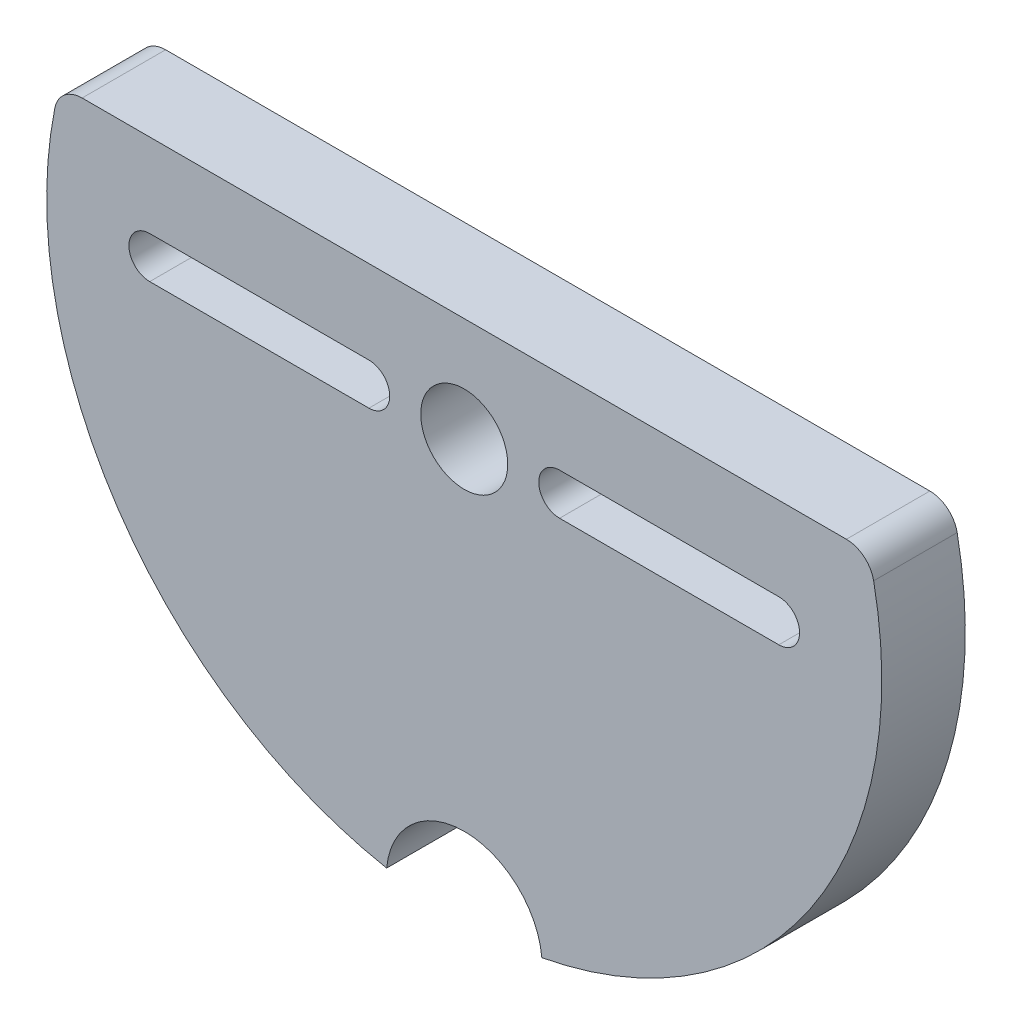
ISO-10303-21;
HEADER;
FILE_DESCRIPTION(('STEP AP214'),'2;1');
FILE_NAME('part.step','',(''),(''),'','','');
FILE_SCHEMA(('AUTOMOTIVE_DESIGN { 1 0 10303 214 1 1 1 1 }'));
ENDSEC;
DATA;
#1=APPLICATION_CONTEXT('core data for automotive mechanical design processes');
#2=APPLICATION_PROTOCOL_DEFINITION('international standard','automotive_design',2000,#1);
#3=PRODUCT_CONTEXT('',#1,'mechanical');
#4=PRODUCT('Part','Part','',(#3));
#5=PRODUCT_RELATED_PRODUCT_CATEGORY('part','',(#4));
#6=PRODUCT_DEFINITION_FORMATION('','',#4);
#7=PRODUCT_DEFINITION_CONTEXT('part definition',#1,'design');
#8=PRODUCT_DEFINITION('design','',#6,#7);
#9=PRODUCT_DEFINITION_SHAPE('','',#8);
#10=(LENGTH_UNIT() NAMED_UNIT(*) SI_UNIT(.MILLI.,.METRE.));
#11=(NAMED_UNIT(*) PLANE_ANGLE_UNIT() SI_UNIT($,.RADIAN.));
#12=(NAMED_UNIT(*) SI_UNIT($,.STERADIAN.) SOLID_ANGLE_UNIT());
#13=UNCERTAINTY_MEASURE_WITH_UNIT(LENGTH_MEASURE(1.E-05),#10,'distance_accuracy_value','');
#14=(GEOMETRIC_REPRESENTATION_CONTEXT(3) GLOBAL_UNCERTAINTY_ASSIGNED_CONTEXT((#13)) GLOBAL_UNIT_ASSIGNED_CONTEXT((#10,
#11,#12)) REPRESENTATION_CONTEXT('',''));
#15=CARTESIAN_POINT('',(0.,0.,0.));
#16=DIRECTION('',(0.,0.,1.));
#17=DIRECTION('',(1.,0.,0.));
#18=AXIS2_PLACEMENT_3D('',#15,#16,#17);
#19=CARTESIAN_POINT('',(0.,-19.05,3.81));
#20=DIRECTION('',(0.,0.,-1.));
#21=DIRECTION('',(-1.,0.,0.));
#22=AXIS2_PLACEMENT_3D('',#19,#20,#21);
#23=CYLINDRICAL_SURFACE('',#22,3.556);
#24=CARTESIAN_POINT('',(0.,-19.05,0.));
#25=DIRECTION('',(0.,0.,-1.));
#26=DIRECTION('',(-1.,0.,0.));
#27=AXIS2_PLACEMENT_3D('',#24,#25,#26);
#28=CIRCLE('',#27,3.556);
#29=CARTESIAN_POINT('',(-3.54047776652939,-18.7181066666667,0.));
#30=VERTEX_POINT('',#29);
#31=CARTESIAN_POINT('',(3.54047776652939,-18.7181066666667,0.));
#32=VERTEX_POINT('',#31);
#33=EDGE_CURVE('E172',#30,#32,#28,.T.);
#34=ORIENTED_EDGE('',*,*,#33,.T.);
#35=DIRECTION('',(0.,0.,-1.));
#36=VECTOR('',#35,1.);
#37=CARTESIAN_POINT('',(3.54047776652939,-18.7181066666667,3.81));
#38=LINE('',#37,#36);
#39=CARTESIAN_POINT('',(3.54047776652939,-18.7181066666667,3.81));
#40=VERTEX_POINT('',#39);
#41=EDGE_CURVE('E11',#40,#32,#38,.T.);
#42=ORIENTED_EDGE('',*,*,#41,.F.);
#43=CARTESIAN_POINT('',(0.,-19.05,3.81));
#44=DIRECTION('',(0.,0.,-1.));
#45=DIRECTION('',(-1.,0.,0.));
#46=AXIS2_PLACEMENT_3D('',#43,#44,#45);
#47=CIRCLE('',#46,3.556);
#48=CARTESIAN_POINT('',(-3.54047776652939,-18.7181066666667,3.81));
#49=VERTEX_POINT('',#48);
#50=EDGE_CURVE('E211',#49,#40,#47,.T.);
#51=ORIENTED_EDGE('',*,*,#50,.F.);
#52=DIRECTION('',(0.,0.,-1.));
#53=VECTOR('',#52,1.);
#54=CARTESIAN_POINT('',(-3.54047776652939,-18.7181066666667,3.81));
#55=LINE('',#54,#53);
#56=EDGE_CURVE('E225',#49,#30,#55,.T.);
#57=ORIENTED_EDGE('',*,*,#56,.T.);
#58=EDGE_LOOP('',(#34,#42,#51,#57));
#59=FACE_BOUND('',#58,.T.);
#60=ADVANCED_FACE('F35',(#59),#23,.F.);
#61=CARTESIAN_POINT('',(0.,0.,3.81));
#62=DIRECTION('',(0.,0.,-1.));
#63=DIRECTION('',(-1.,0.,0.));
#64=AXIS2_PLACEMENT_3D('',#61,#62,#63);
#65=CYLINDRICAL_SURFACE('',#64,19.05);
#66=CARTESIAN_POINT('',(0.,0.,0.));
#67=DIRECTION('',(0.,0.,1.));
#68=DIRECTION('',(-1.,0.,0.));
#69=AXIS2_PLACEMENT_3D('',#66,#67,#68);
#70=CIRCLE('',#69,19.05);
#71=CARTESIAN_POINT('',(18.6788705034442,3.74196428571429,0.));
#72=VERTEX_POINT('',#71);
#73=EDGE_CURVE('E228',#32,#72,#70,.T.);
#74=ORIENTED_EDGE('',*,*,#73,.T.);
#75=DIRECTION('',(0.,0.,-1.));
#76=VECTOR('',#75,1.);
#77=CARTESIAN_POINT('',(18.6788705034442,3.74196428571429,3.81));
#78=LINE('',#77,#76);
#79=CARTESIAN_POINT('',(18.6788705034442,3.74196428571429,3.81));
#80=VERTEX_POINT('',#79);
#81=EDGE_CURVE('E42',#80,#72,#78,.T.);
#82=ORIENTED_EDGE('',*,*,#81,.F.);
#83=CARTESIAN_POINT('',(0.,0.,3.81));
#84=DIRECTION('',(0.,0.,1.));
#85=DIRECTION('',(-1.,0.,0.));
#86=AXIS2_PLACEMENT_3D('',#83,#84,#85);
#87=CIRCLE('',#86,19.05);
#88=EDGE_CURVE('E214',#40,#80,#87,.T.);
#89=ORIENTED_EDGE('',*,*,#88,.F.);
#90=ORIENTED_EDGE('',*,*,#41,.T.);
#91=EDGE_LOOP('',(#74,#82,#89,#90));
#92=FACE_BOUND('',#91,.T.);
#93=ADVANCED_FACE('F274',(#92),#65,.T.);
#94=CARTESIAN_POINT('',(17.4336124698813,3.4925,3.81));
#95=DIRECTION('',(0.,0.,-1.));
#96=DIRECTION('',(-1.,0.,0.));
#97=AXIS2_PLACEMENT_3D('',#94,#95,#96);
#98=CYLINDRICAL_SURFACE('',#97,1.27);
#99=CARTESIAN_POINT('',(17.4336124698813,3.4925,0.));
#100=DIRECTION('',(0.,0.,1.));
#101=DIRECTION('',(-1.,0.,0.));
#102=AXIS2_PLACEMENT_3D('',#99,#100,#101);
#103=CIRCLE('',#102,1.27);
#104=CARTESIAN_POINT('',(17.4336124698813,4.7625,0.));
#105=VERTEX_POINT('',#104);
#106=EDGE_CURVE('E230',#72,#105,#103,.T.);
#107=ORIENTED_EDGE('',*,*,#106,.T.);
#108=DIRECTION('',(0.,0.,-1.));
#109=VECTOR('',#108,1.);
#110=CARTESIAN_POINT('',(17.4336124698813,4.7625,3.81));
#111=LINE('',#110,#109);
#112=CARTESIAN_POINT('',(17.4336124698813,4.7625,3.81));
#113=VERTEX_POINT('',#112);
#114=EDGE_CURVE('E245',#113,#105,#111,.T.);
#115=ORIENTED_EDGE('',*,*,#114,.F.);
#116=CARTESIAN_POINT('',(17.4336124698813,3.4925,3.81));
#117=DIRECTION('',(0.,0.,1.));
#118=DIRECTION('',(-1.,0.,0.));
#119=AXIS2_PLACEMENT_3D('',#116,#117,#118);
#120=CIRCLE('',#119,1.27);
#121=EDGE_CURVE('E217',#80,#113,#120,.T.);
#122=ORIENTED_EDGE('',*,*,#121,.F.);
#123=ORIENTED_EDGE('',*,*,#81,.T.);
#124=EDGE_LOOP('',(#107,#115,#122,#123));
#125=FACE_BOUND('',#124,.T.);
#126=ADVANCED_FACE('F252',(#125),#98,.T.);
#127=CARTESIAN_POINT('',(17.4336124698813,4.7625,3.81));
#128=DIRECTION('',(0.,-1.,0.));
#129=DIRECTION('',(1.,0.,0.));
#130=AXIS2_PLACEMENT_3D('',#127,#128,#129);
#131=PLANE('',#130);
#132=DIRECTION('',(-1.,0.,0.));
#133=VECTOR('',#132,1.);
#134=CARTESIAN_POINT('',(17.4336124698813,4.7625,0.));
#135=LINE('',#134,#133);
#136=CARTESIAN_POINT('',(-17.4336124698813,4.7625,0.));
#137=VERTEX_POINT('',#136);
#138=EDGE_CURVE('E232',#105,#137,#135,.T.);
#139=ORIENTED_EDGE('',*,*,#138,.T.);
#140=DIRECTION('',(0.,0.,-1.));
#141=VECTOR('',#140,1.);
#142=CARTESIAN_POINT('',(-17.4336124698813,4.7625,3.81));
#143=LINE('',#142,#141);
#144=CARTESIAN_POINT('',(-17.4336124698813,4.7625,3.81));
#145=VERTEX_POINT('',#144);
#146=EDGE_CURVE('E242',#145,#137,#143,.T.);
#147=ORIENTED_EDGE('',*,*,#146,.F.);
#148=DIRECTION('',(-1.,0.,0.));
#149=VECTOR('',#148,1.);
#150=CARTESIAN_POINT('',(17.4336124698813,4.7625,3.81));
#151=LINE('',#150,#149);
#152=EDGE_CURVE('E219',#113,#145,#151,.T.);
#153=ORIENTED_EDGE('',*,*,#152,.F.);
#154=ORIENTED_EDGE('',*,*,#114,.T.);
#155=EDGE_LOOP('',(#139,#147,#153,#154));
#156=FACE_BOUND('',#155,.T.);
#157=ADVANCED_FACE('F262',(#156),#131,.F.);
#158=CARTESIAN_POINT('',(-17.4336124698813,3.4925,3.81));
#159=DIRECTION('',(0.,0.,-1.));
#160=DIRECTION('',(-1.,0.,0.));
#161=AXIS2_PLACEMENT_3D('',#158,#159,#160);
#162=CYLINDRICAL_SURFACE('',#161,1.27);
#163=CARTESIAN_POINT('',(-17.4336124698813,3.4925,0.));
#164=DIRECTION('',(0.,0.,1.));
#165=DIRECTION('',(1.,0.,0.));
#166=AXIS2_PLACEMENT_3D('',#163,#164,#165);
#167=CIRCLE('',#166,1.27);
#168=CARTESIAN_POINT('',(-18.6788705034442,3.74196428571428,0.));
#169=VERTEX_POINT('',#168);
#170=EDGE_CURVE('E234',#137,#169,#167,.T.);
#171=ORIENTED_EDGE('',*,*,#170,.T.);
#172=DIRECTION('',(0.,0.,-1.));
#173=VECTOR('',#172,1.);
#174=CARTESIAN_POINT('',(-18.6788705034442,3.74196428571428,3.81));
#175=LINE('',#174,#173);
#176=CARTESIAN_POINT('',(-18.6788705034442,3.74196428571428,3.81));
#177=VERTEX_POINT('',#176);
#178=EDGE_CURVE('E239',#177,#169,#175,.T.);
#179=ORIENTED_EDGE('',*,*,#178,.F.);
#180=CARTESIAN_POINT('',(-17.4336124698813,3.4925,3.81));
#181=DIRECTION('',(0.,0.,1.));
#182=DIRECTION('',(1.,0.,0.));
#183=AXIS2_PLACEMENT_3D('',#180,#181,#182);
#184=CIRCLE('',#183,1.27);
#185=EDGE_CURVE('E221',#145,#177,#184,.T.);
#186=ORIENTED_EDGE('',*,*,#185,.F.);
#187=ORIENTED_EDGE('',*,*,#146,.T.);
#188=EDGE_LOOP('',(#171,#179,#186,#187));
#189=FACE_BOUND('',#188,.T.);
#190=ADVANCED_FACE('F266',(#189),#162,.T.);
#191=CARTESIAN_POINT('',(0.,0.,3.81));
#192=DIRECTION('',(0.,0.,-1.));
#193=DIRECTION('',(-1.,0.,0.));
#194=AXIS2_PLACEMENT_3D('',#191,#192,#193);
#195=CYLINDRICAL_SURFACE('',#194,19.05);
#196=CARTESIAN_POINT('',(0.,0.,0.));
#197=DIRECTION('',(0.,0.,1.));
#198=DIRECTION('',(1.,0.,0.));
#199=AXIS2_PLACEMENT_3D('',#196,#197,#198);
#200=CIRCLE('',#199,19.05);
#201=EDGE_CURVE('E215',#169,#30,#200,.T.);
#202=ORIENTED_EDGE('',*,*,#201,.T.);
#203=ORIENTED_EDGE('',*,*,#56,.F.);
#204=CARTESIAN_POINT('',(0.,0.,3.81));
#205=DIRECTION('',(0.,0.,1.));
#206=DIRECTION('',(1.,0.,0.));
#207=AXIS2_PLACEMENT_3D('',#204,#205,#206);
#208=CIRCLE('',#207,19.05);
#209=EDGE_CURVE('E223',#177,#49,#208,.T.);
#210=ORIENTED_EDGE('',*,*,#209,.F.);
#211=ORIENTED_EDGE('',*,*,#178,.T.);
#212=EDGE_LOOP('',(#202,#203,#210,#211));
#213=FACE_BOUND('',#212,.T.);
#214=ADVANCED_FACE('F277',(#213),#195,.T.);
#215=CARTESIAN_POINT('',(0.,-19.05,3.81));
#216=DIRECTION('',(0.,0.,-1.));
#217=DIRECTION('',(-1.,0.,0.));
#218=AXIS2_PLACEMENT_3D('',#215,#216,#217);
#219=PLANE('',#218);
#220=DIRECTION('',(1.,0.,0.));
#221=VECTOR('',#220,1.);
#222=CARTESIAN_POINT('',(-14.350000002,-0.95,3.81));
#223=LINE('',#222,#221);
#224=CARTESIAN_POINT('',(-14.350000002,-0.949999999999999,3.81));
#225=VERTEX_POINT('',#224);
#226=CARTESIAN_POINT('',(-4.35,-0.95,3.81));
#227=VERTEX_POINT('',#226);
#228=EDGE_CURVE('E165',#225,#227,#223,.T.);
#229=ORIENTED_EDGE('',*,*,#228,.F.);
#230=CARTESIAN_POINT('',(-14.350000002,0.,3.81));
#231=DIRECTION('',(0.,0.,1.));
#232=DIRECTION('',(1.,0.,0.));
#233=AXIS2_PLACEMENT_3D('',#230,#231,#232);
#234=CIRCLE('',#233,0.95);
#235=CARTESIAN_POINT('',(-14.350000002,0.95,3.81));
#236=VERTEX_POINT('',#235);
#237=EDGE_CURVE('E49',#236,#225,#234,.T.);
#238=ORIENTED_EDGE('',*,*,#237,.F.);
#239=DIRECTION('',(-1.,0.,0.));
#240=VECTOR('',#239,1.);
#241=CARTESIAN_POINT('',(-14.350000002,0.95,3.81));
#242=LINE('',#241,#240);
#243=CARTESIAN_POINT('',(-4.35,0.95,3.81));
#244=VERTEX_POINT('',#243);
#245=EDGE_CURVE('E156',#244,#236,#242,.T.);
#246=ORIENTED_EDGE('',*,*,#245,.F.);
#247=CARTESIAN_POINT('',(-4.35,0.,3.81));
#248=DIRECTION('',(0.,0.,1.));
#249=DIRECTION('',(1.,0.,0.));
#250=AXIS2_PLACEMENT_3D('',#247,#248,#249);
#251=CIRCLE('',#250,0.95);
#252=EDGE_CURVE('E159',#227,#244,#251,.T.);
#253=ORIENTED_EDGE('',*,*,#252,.F.);
#254=EDGE_LOOP('',(#229,#238,#246,#253));
#255=FACE_BOUND('',#254,.T.);
#256=DIRECTION('',(1.,0.,0.));
#257=VECTOR('',#256,1.);
#258=CARTESIAN_POINT('',(4.35,-0.95,3.81));
#259=LINE('',#258,#257);
#260=CARTESIAN_POINT('',(4.35,-0.950000000000001,3.81));
#261=VERTEX_POINT('',#260);
#262=CARTESIAN_POINT('',(14.350000002,-0.950000000000001,3.81));
#263=VERTEX_POINT('',#262);
#264=EDGE_CURVE('E191',#261,#263,#259,.T.);
#265=ORIENTED_EDGE('',*,*,#264,.F.);
#266=CARTESIAN_POINT('',(4.35,0.,3.81));
#267=DIRECTION('',(0.,0.,1.));
#268=DIRECTION('',(1.,0.,0.));
#269=AXIS2_PLACEMENT_3D('',#266,#267,#268);
#270=CIRCLE('',#269,0.95);
#271=CARTESIAN_POINT('',(4.35,0.95,3.81));
#272=VERTEX_POINT('',#271);
#273=EDGE_CURVE('E57',#272,#261,#270,.T.);
#274=ORIENTED_EDGE('',*,*,#273,.F.);
#275=DIRECTION('',(-1.,0.,0.));
#276=VECTOR('',#275,1.);
#277=CARTESIAN_POINT('',(4.35,0.95,3.81));
#278=LINE('',#277,#276);
#279=CARTESIAN_POINT('',(14.350000002,0.950000000000005,3.81));
#280=VERTEX_POINT('',#279);
#281=EDGE_CURVE('E180',#280,#272,#278,.T.);
#282=ORIENTED_EDGE('',*,*,#281,.F.);
#283=CARTESIAN_POINT('',(14.350000002,0.,3.81));
#284=DIRECTION('',(0.,0.,1.));
#285=DIRECTION('',(1.,0.,0.));
#286=AXIS2_PLACEMENT_3D('',#283,#284,#285);
#287=CIRCLE('',#286,0.95);
#288=EDGE_CURVE('E195',#263,#280,#287,.T.);
#289=ORIENTED_EDGE('',*,*,#288,.F.);
#290=EDGE_LOOP('',(#265,#274,#282,#289));
#291=FACE_BOUND('',#290,.T.);
#292=CARTESIAN_POINT('',(0.,0.,3.81));
#293=DIRECTION('',(0.,0.,1.));
#294=DIRECTION('',(1.,0.,0.));
#295=AXIS2_PLACEMENT_3D('',#292,#293,#294);
#296=CIRCLE('',#295,1.984375);
#297=CARTESIAN_POINT('',(1.984375,0.,3.81));
#298=VERTEX_POINT('',#297);
#299=EDGE_CURVE('E208',#298,#298,#296,.T.);
#300=ORIENTED_EDGE('',*,*,#299,.F.);
#301=EDGE_LOOP('',(#300));
#302=FACE_BOUND('',#301,.T.);
#303=ORIENTED_EDGE('',*,*,#50,.T.);
#304=ORIENTED_EDGE('',*,*,#88,.T.);
#305=ORIENTED_EDGE('',*,*,#121,.T.);
#306=ORIENTED_EDGE('',*,*,#152,.T.);
#307=ORIENTED_EDGE('',*,*,#185,.T.);
#308=ORIENTED_EDGE('',*,*,#209,.T.);
#309=EDGE_LOOP('',(#303,#304,#305,#306,#307,#308));
#310=FACE_BOUND('',#309,.T.);
#311=ADVANCED_FACE('F270',(#255,#291,#302,#310),#219,.F.);
#312=CARTESIAN_POINT('',(0.,-19.05,0.));
#313=DIRECTION('',(0.,0.,-1.));
#314=DIRECTION('',(-1.,0.,0.));
#315=AXIS2_PLACEMENT_3D('',#312,#313,#314);
#316=PLANE('',#315);
#317=CARTESIAN_POINT('',(-14.350000002,0.,0.));
#318=DIRECTION('',(0.,0.,1.));
#319=DIRECTION('',(1.,0.,0.));
#320=AXIS2_PLACEMENT_3D('',#317,#318,#319);
#321=CIRCLE('',#320,0.95);
#322=CARTESIAN_POINT('',(-14.350000002,0.95,0.));
#323=VERTEX_POINT('',#322);
#324=CARTESIAN_POINT('',(-14.350000002,-0.95,0.));
#325=VERTEX_POINT('',#324);
#326=EDGE_CURVE('E137',#323,#325,#321,.T.);
#327=ORIENTED_EDGE('',*,*,#326,.T.);
#328=DIRECTION('',(1.,0.,0.));
#329=VECTOR('',#328,1.);
#330=CARTESIAN_POINT('',(-14.350000002,-0.95,0.));
#331=LINE('',#330,#329);
#332=CARTESIAN_POINT('',(-4.35,-0.95,0.));
#333=VERTEX_POINT('',#332);
#334=EDGE_CURVE('E147',#325,#333,#331,.T.);
#335=ORIENTED_EDGE('',*,*,#334,.T.);
#336=CARTESIAN_POINT('',(-4.35,0.,0.));
#337=DIRECTION('',(0.,0.,1.));
#338=DIRECTION('',(1.,0.,0.));
#339=AXIS2_PLACEMENT_3D('',#336,#337,#338);
#340=CIRCLE('',#339,0.95);
#341=CARTESIAN_POINT('',(-4.35,0.95,0.));
#342=VERTEX_POINT('',#341);
#343=EDGE_CURVE('E151',#333,#342,#340,.T.);
#344=ORIENTED_EDGE('',*,*,#343,.T.);
#345=DIRECTION('',(-1.,0.,0.));
#346=VECTOR('',#345,1.);
#347=CARTESIAN_POINT('',(-14.350000002,0.95,0.));
#348=LINE('',#347,#346);
#349=EDGE_CURVE('E143',#342,#323,#348,.T.);
#350=ORIENTED_EDGE('',*,*,#349,.T.);
#351=EDGE_LOOP('',(#327,#335,#344,#350));
#352=FACE_BOUND('',#351,.T.);
#353=CARTESIAN_POINT('',(4.35,0.,0.));
#354=DIRECTION('',(0.,0.,1.));
#355=DIRECTION('',(1.,0.,0.));
#356=AXIS2_PLACEMENT_3D('',#353,#354,#355);
#357=CIRCLE('',#356,0.95);
#358=CARTESIAN_POINT('',(4.35,0.95,0.));
#359=VERTEX_POINT('',#358);
#360=CARTESIAN_POINT('',(4.35,-0.95,0.));
#361=VERTEX_POINT('',#360);
#362=EDGE_CURVE('E176',#359,#361,#357,.T.);
#363=ORIENTED_EDGE('',*,*,#362,.T.);
#364=DIRECTION('',(1.,0.,0.));
#365=VECTOR('',#364,1.);
#366=CARTESIAN_POINT('',(4.35,-0.95,0.));
#367=LINE('',#366,#365);
#368=CARTESIAN_POINT('',(14.350000002,-0.949999999999995,0.));
#369=VERTEX_POINT('',#368);
#370=EDGE_CURVE('E179',#361,#369,#367,.T.);
#371=ORIENTED_EDGE('',*,*,#370,.T.);
#372=CARTESIAN_POINT('',(14.350000002,0.,0.));
#373=DIRECTION('',(0.,0.,1.));
#374=DIRECTION('',(1.,0.,0.));
#375=AXIS2_PLACEMENT_3D('',#372,#373,#374);
#376=CIRCLE('',#375,0.95);
#377=CARTESIAN_POINT('',(14.350000002,0.950000000000005,0.));
#378=VERTEX_POINT('',#377);
#379=EDGE_CURVE('E183',#369,#378,#376,.T.);
#380=ORIENTED_EDGE('',*,*,#379,.T.);
#381=DIRECTION('',(-1.,0.,0.));
#382=VECTOR('',#381,1.);
#383=CARTESIAN_POINT('',(4.35,0.95,0.));
#384=LINE('',#383,#382);
#385=EDGE_CURVE('E186',#378,#359,#384,.T.);
#386=ORIENTED_EDGE('',*,*,#385,.T.);
#387=EDGE_LOOP('',(#363,#371,#380,#386));
#388=FACE_BOUND('',#387,.T.);
#389=CARTESIAN_POINT('',(0.,0.,0.));
#390=DIRECTION('',(0.,0.,1.));
#391=DIRECTION('',(1.,0.,0.));
#392=AXIS2_PLACEMENT_3D('',#389,#390,#391);
#393=CIRCLE('',#392,1.984375);
#394=CARTESIAN_POINT('',(1.984375,0.,0.));
#395=VERTEX_POINT('',#394);
#396=EDGE_CURVE('E192',#395,#395,#393,.T.);
#397=ORIENTED_EDGE('',*,*,#396,.T.);
#398=EDGE_LOOP('',(#397));
#399=FACE_BOUND('',#398,.T.);
#400=ORIENTED_EDGE('',*,*,#33,.F.);
#401=ORIENTED_EDGE('',*,*,#201,.F.);
#402=ORIENTED_EDGE('',*,*,#170,.F.);
#403=ORIENTED_EDGE('',*,*,#138,.F.);
#404=ORIENTED_EDGE('',*,*,#106,.F.);
#405=ORIENTED_EDGE('',*,*,#73,.F.);
#406=EDGE_LOOP('',(#400,#401,#402,#403,#404,#405));
#407=FACE_BOUND('',#406,.T.);
#408=ADVANCED_FACE('F153',(#352,#388,#399,#407),#316,.T.);
#409=CARTESIAN_POINT('',(0.,0.,0.));
#410=DIRECTION('',(0.,0.,1.));
#411=DIRECTION('',(1.,0.,0.));
#412=AXIS2_PLACEMENT_3D('',#409,#410,#411);
#413=CYLINDRICAL_SURFACE('',#412,1.984375);
#414=CARTESIAN_POINT('',(1.984375,0.,0.));
#415=CARTESIAN_POINT('',(1.984375,0.,0.0396874999999999));
#416=CARTESIAN_POINT('',(1.984375,0.,0.079375));
#417=CARTESIAN_POINT('',(1.984375,0.,0.15875));
#418=CARTESIAN_POINT('',(1.984375,0.,0.1984375));
#419=CARTESIAN_POINT('',(1.984375,0.,0.2778125));
#420=CARTESIAN_POINT('',(1.984375,0.,0.3175));
#421=CARTESIAN_POINT('',(1.984375,0.,0.396875));
#422=CARTESIAN_POINT('',(1.984375,0.,0.4365625));
#423=CARTESIAN_POINT('',(1.984375,0.,0.5159375));
#424=CARTESIAN_POINT('',(1.984375,0.,0.555625));
#425=CARTESIAN_POINT('',(1.984375,0.,0.635));
#426=CARTESIAN_POINT('',(1.984375,0.,0.6746875));
#427=CARTESIAN_POINT('',(1.984375,0.,0.7540625));
#428=CARTESIAN_POINT('',(1.984375,0.,0.79375));
#429=CARTESIAN_POINT('',(1.984375,0.,0.873125));
#430=CARTESIAN_POINT('',(1.984375,0.,0.9128125));
#431=CARTESIAN_POINT('',(1.984375,0.,0.9921875));
#432=CARTESIAN_POINT('',(1.984375,0.,1.031875));
#433=CARTESIAN_POINT('',(1.984375,0.,1.11125));
#434=CARTESIAN_POINT('',(1.984375,0.,1.1509375));
#435=CARTESIAN_POINT('',(1.984375,0.,1.2303125));
#436=CARTESIAN_POINT('',(1.984375,0.,1.27));
#437=CARTESIAN_POINT('',(1.984375,0.,1.349375));
#438=CARTESIAN_POINT('',(1.984375,0.,1.3890625));
#439=CARTESIAN_POINT('',(1.984375,0.,1.4684375));
#440=CARTESIAN_POINT('',(1.984375,0.,1.508125));
#441=CARTESIAN_POINT('',(1.984375,0.,1.5875));
#442=CARTESIAN_POINT('',(1.984375,0.,1.6271875));
#443=CARTESIAN_POINT('',(1.984375,0.,1.7065625));
#444=CARTESIAN_POINT('',(1.984375,0.,1.74625));
#445=CARTESIAN_POINT('',(1.984375,0.,1.825625));
#446=CARTESIAN_POINT('',(1.984375,0.,1.8653125));
#447=CARTESIAN_POINT('',(1.984375,0.,1.9446875));
#448=CARTESIAN_POINT('',(1.984375,0.,1.984375));
#449=CARTESIAN_POINT('',(1.984375,0.,2.06375));
#450=CARTESIAN_POINT('',(1.984375,0.,2.1034375));
#451=CARTESIAN_POINT('',(1.984375,0.,2.1828125));
#452=CARTESIAN_POINT('',(1.984375,0.,2.2225));
#453=CARTESIAN_POINT('',(1.984375,0.,2.301875));
#454=CARTESIAN_POINT('',(1.984375,0.,2.3415625));
#455=CARTESIAN_POINT('',(1.984375,0.,2.4209375));
#456=CARTESIAN_POINT('',(1.984375,0.,2.460625));
#457=CARTESIAN_POINT('',(1.984375,0.,2.54));
#458=CARTESIAN_POINT('',(1.984375,0.,2.5796875));
#459=CARTESIAN_POINT('',(1.984375,0.,2.6590625));
#460=CARTESIAN_POINT('',(1.984375,0.,2.69875));
#461=CARTESIAN_POINT('',(1.984375,0.,2.778125));
#462=CARTESIAN_POINT('',(1.984375,0.,2.8178125));
#463=CARTESIAN_POINT('',(1.984375,0.,2.8971875));
#464=CARTESIAN_POINT('',(1.984375,0.,2.936875));
#465=CARTESIAN_POINT('',(1.984375,0.,3.01625));
#466=CARTESIAN_POINT('',(1.984375,0.,3.0559375));
#467=CARTESIAN_POINT('',(1.984375,0.,3.1353125));
#468=CARTESIAN_POINT('',(1.984375,0.,3.175));
#469=CARTESIAN_POINT('',(1.984375,0.,3.254375));
#470=CARTESIAN_POINT('',(1.984375,0.,3.2940625));
#471=CARTESIAN_POINT('',(1.984375,0.,3.3734375));
#472=CARTESIAN_POINT('',(1.984375,0.,3.413125));
#473=CARTESIAN_POINT('',(1.984375,0.,3.4925));
#474=CARTESIAN_POINT('',(1.984375,0.,3.5321875));
#475=CARTESIAN_POINT('',(1.984375,0.,3.6115625));
#476=CARTESIAN_POINT('',(1.984375,0.,3.65125));
#477=CARTESIAN_POINT('',(1.984375,0.,3.730625));
#478=CARTESIAN_POINT('',(1.984375,0.,3.7703125));
#479=CARTESIAN_POINT('',(1.984375,0.,3.81));
#480=B_SPLINE_CURVE_WITH_KNOTS('',3,(#414,#415,#416,#417,#418,#419,#420,#421,#422,#423,#424,
#425,#426,#427,#428,#429,#430,#431,#432,#433,#434,#435,#436,#437,#438,#439,#440,#441,#442,#443,
#444,#445,#446,#447,#448,#449,#450,#451,#452,#453,#454,#455,#456,#457,#458,#459,#460,#461,#462,
#463,#464,#465,#466,#467,#468,#469,#470,#471,#472,#473,#474,#475,#476,#477,#478,#479),
.UNSPECIFIED.,.F.,.F.,(4,2,2,2,2,2,2,2,2,2,2,2,2,2,2,2,2,2,2,2,2,2,2,2,2,2,2,2,2,2,2,2,4),(0.,
0.1190625,0.238125,0.3571875,0.47625,0.5953125,0.714375,0.8334375,0.9525,1.0715625,1.190625,
1.3096875,1.42875,1.5478125,1.666875,1.7859375,1.905,2.0240625,2.143125,2.2621875,2.38125,
2.5003125,2.619375,2.7384375,2.8575,2.9765625,3.095625,3.2146875,3.33375,3.4528125,3.571875,
3.6909375,3.81),.UNSPECIFIED.);
#481=EDGE_CURVE('BSEAM325',#395,#298,#480,.T.);
#482=ORIENTED_EDGE('',*,*,#396,.F.);
#483=ORIENTED_EDGE('',*,*,#299,.T.);
#484=ORIENTED_EDGE('',*,*,#481,.T.);
#485=ORIENTED_EDGE('',*,*,#481,.F.);
#486=EDGE_LOOP('',(#482,#484,#483,#485));
#487=FACE_BOUND('',#486,.T.);
#488=ADVANCED_FACE('F325',(#487),#413,.F.);
#489=CARTESIAN_POINT('',(4.35,0.,0.));
#490=DIRECTION('',(0.,0.,1.));
#491=DIRECTION('',(1.,0.,0.));
#492=AXIS2_PLACEMENT_3D('',#489,#490,#491);
#493=CYLINDRICAL_SURFACE('',#492,0.95);
#494=ORIENTED_EDGE('',*,*,#273,.T.);
#495=DIRECTION('',(0.,0.,1.));
#496=VECTOR('',#495,1.);
#497=CARTESIAN_POINT('',(4.35,-0.95,0.));
#498=LINE('',#497,#496);
#499=EDGE_CURVE('E189',#361,#261,#498,.T.);
#500=ORIENTED_EDGE('',*,*,#499,.F.);
#501=ORIENTED_EDGE('',*,*,#362,.F.);
#502=DIRECTION('',(0.,0.,1.));
#503=VECTOR('',#502,1.);
#504=CARTESIAN_POINT('',(4.35,0.95,0.));
#505=LINE('',#504,#503);
#506=EDGE_CURVE('E166',#359,#272,#505,.T.);
#507=ORIENTED_EDGE('',*,*,#506,.T.);
#508=EDGE_LOOP('',(#494,#500,#501,#507));
#509=FACE_BOUND('',#508,.T.);
#510=ADVANCED_FACE('F333',(#509),#493,.F.);
#511=CARTESIAN_POINT('',(4.35,0.95,0.));
#512=DIRECTION('',(0.,1.,0.));
#513=DIRECTION('',(-1.,0.,0.));
#514=AXIS2_PLACEMENT_3D('',#511,#512,#513);
#515=PLANE('',#514);
#516=ORIENTED_EDGE('',*,*,#281,.T.);
#517=ORIENTED_EDGE('',*,*,#506,.F.);
#518=ORIENTED_EDGE('',*,*,#385,.F.);
#519=DIRECTION('',(0.,0.,1.));
#520=VECTOR('',#519,1.);
#521=CARTESIAN_POINT('',(14.350000002,0.950000000000005,0.));
#522=LINE('',#521,#520);
#523=EDGE_CURVE('E201',#378,#280,#522,.T.);
#524=ORIENTED_EDGE('',*,*,#523,.T.);
#525=EDGE_LOOP('',(#516,#517,#518,#524));
#526=FACE_BOUND('',#525,.T.);
#527=ADVANCED_FACE('F343',(#526),#515,.F.);
#528=CARTESIAN_POINT('',(14.350000002,0.,0.));
#529=DIRECTION('',(0.,0.,1.));
#530=DIRECTION('',(1.,0.,0.));
#531=AXIS2_PLACEMENT_3D('',#528,#529,#530);
#532=CYLINDRICAL_SURFACE('',#531,0.95);
#533=ORIENTED_EDGE('',*,*,#288,.T.);
#534=ORIENTED_EDGE('',*,*,#523,.F.);
#535=ORIENTED_EDGE('',*,*,#379,.F.);
#536=DIRECTION('',(0.,0.,1.));
#537=VECTOR('',#536,1.);
#538=CARTESIAN_POINT('',(14.350000002,-0.950000000000001,0.));
#539=LINE('',#538,#537);
#540=EDGE_CURVE('E203',#369,#263,#539,.T.);
#541=ORIENTED_EDGE('',*,*,#540,.T.);
#542=EDGE_LOOP('',(#533,#534,#535,#541));
#543=FACE_BOUND('',#542,.T.);
#544=ADVANCED_FACE('F352',(#543),#532,.F.);
#545=CARTESIAN_POINT('',(4.35,-0.95,0.));
#546=DIRECTION('',(0.,-1.,0.));
#547=DIRECTION('',(1.,0.,0.));
#548=AXIS2_PLACEMENT_3D('',#545,#546,#547);
#549=PLANE('',#548);
#550=ORIENTED_EDGE('',*,*,#264,.T.);
#551=ORIENTED_EDGE('',*,*,#540,.F.);
#552=ORIENTED_EDGE('',*,*,#370,.F.);
#553=ORIENTED_EDGE('',*,*,#499,.T.);
#554=EDGE_LOOP('',(#550,#551,#552,#553));
#555=FACE_BOUND('',#554,.T.);
#556=ADVANCED_FACE('F362',(#555),#549,.F.);
#557=CARTESIAN_POINT('',(-14.350000002,0.,0.));
#558=DIRECTION('',(0.,0.,1.));
#559=DIRECTION('',(1.,0.,0.));
#560=AXIS2_PLACEMENT_3D('',#557,#558,#559);
#561=CYLINDRICAL_SURFACE('',#560,0.95);
#562=ORIENTED_EDGE('',*,*,#237,.T.);
#563=DIRECTION('',(0.,0.,1.));
#564=VECTOR('',#563,1.);
#565=CARTESIAN_POINT('',(-14.350000002,-0.95,0.));
#566=LINE('',#565,#564);
#567=EDGE_CURVE('E133',#325,#225,#566,.T.);
#568=ORIENTED_EDGE('',*,*,#567,.F.);
#569=ORIENTED_EDGE('',*,*,#326,.F.);
#570=DIRECTION('',(0.,0.,1.));
#571=VECTOR('',#570,1.);
#572=CARTESIAN_POINT('',(-14.350000002,0.95,0.));
#573=LINE('',#572,#571);
#574=EDGE_CURVE('E170',#323,#236,#573,.T.);
#575=ORIENTED_EDGE('',*,*,#574,.T.);
#576=EDGE_LOOP('',(#562,#568,#569,#575));
#577=FACE_BOUND('',#576,.T.);
#578=ADVANCED_FACE('F135',(#577),#561,.F.);
#579=CARTESIAN_POINT('',(-14.350000002,0.95,0.));
#580=DIRECTION('',(0.,1.,0.));
#581=DIRECTION('',(-1.,0.,0.));
#582=AXIS2_PLACEMENT_3D('',#579,#580,#581);
#583=PLANE('',#582);
#584=ORIENTED_EDGE('',*,*,#245,.T.);
#585=ORIENTED_EDGE('',*,*,#574,.F.);
#586=ORIENTED_EDGE('',*,*,#349,.F.);
#587=DIRECTION('',(0.,0.,1.));
#588=VECTOR('',#587,1.);
#589=CARTESIAN_POINT('',(-4.35,0.95,0.));
#590=LINE('',#589,#588);
#591=EDGE_CURVE('E173',#342,#244,#590,.T.);
#592=ORIENTED_EDGE('',*,*,#591,.T.);
#593=EDGE_LOOP('',(#584,#585,#586,#592));
#594=FACE_BOUND('',#593,.T.);
#595=ADVANCED_FACE('F381',(#594),#583,.F.);
#596=CARTESIAN_POINT('',(-4.35,0.,0.));
#597=DIRECTION('',(0.,0.,1.));
#598=DIRECTION('',(1.,0.,0.));
#599=AXIS2_PLACEMENT_3D('',#596,#597,#598);
#600=CYLINDRICAL_SURFACE('',#599,0.95);
#601=ORIENTED_EDGE('',*,*,#252,.T.);
#602=ORIENTED_EDGE('',*,*,#591,.F.);
#603=ORIENTED_EDGE('',*,*,#343,.F.);
#604=DIRECTION('',(0.,0.,1.));
#605=VECTOR('',#604,1.);
#606=CARTESIAN_POINT('',(-4.35,-0.95,0.));
#607=LINE('',#606,#605);
#608=EDGE_CURVE('E142',#333,#227,#607,.T.);
#609=ORIENTED_EDGE('',*,*,#608,.T.);
#610=EDGE_LOOP('',(#601,#602,#603,#609));
#611=FACE_BOUND('',#610,.T.);
#612=ADVANCED_FACE('F390',(#611),#600,.F.);
#613=CARTESIAN_POINT('',(-14.350000002,-0.95,0.));
#614=DIRECTION('',(0.,-1.,0.));
#615=DIRECTION('',(1.,0.,0.));
#616=AXIS2_PLACEMENT_3D('',#613,#614,#615);
#617=PLANE('',#616);
#618=ORIENTED_EDGE('',*,*,#228,.T.);
#619=ORIENTED_EDGE('',*,*,#608,.F.);
#620=ORIENTED_EDGE('',*,*,#334,.F.);
#621=ORIENTED_EDGE('',*,*,#567,.T.);
#622=EDGE_LOOP('',(#618,#619,#620,#621));
#623=FACE_BOUND('',#622,.T.);
#624=ADVANCED_FACE('F148',(#623),#617,.F.);
#625=CLOSED_SHELL('',(#60,#93,#126,#157,#190,#214,#311,#408,#488,#510,#527,#544,#556,#578,#595,
#612,#624));
#626=MANIFOLD_SOLID_BREP('B2',#625);
#627=ADVANCED_BREP_SHAPE_REPRESENTATION('',(#18,#626),#14);
#628=SHAPE_DEFINITION_REPRESENTATION(#9,#627);
ENDSEC;
END-ISO-10303-21;
